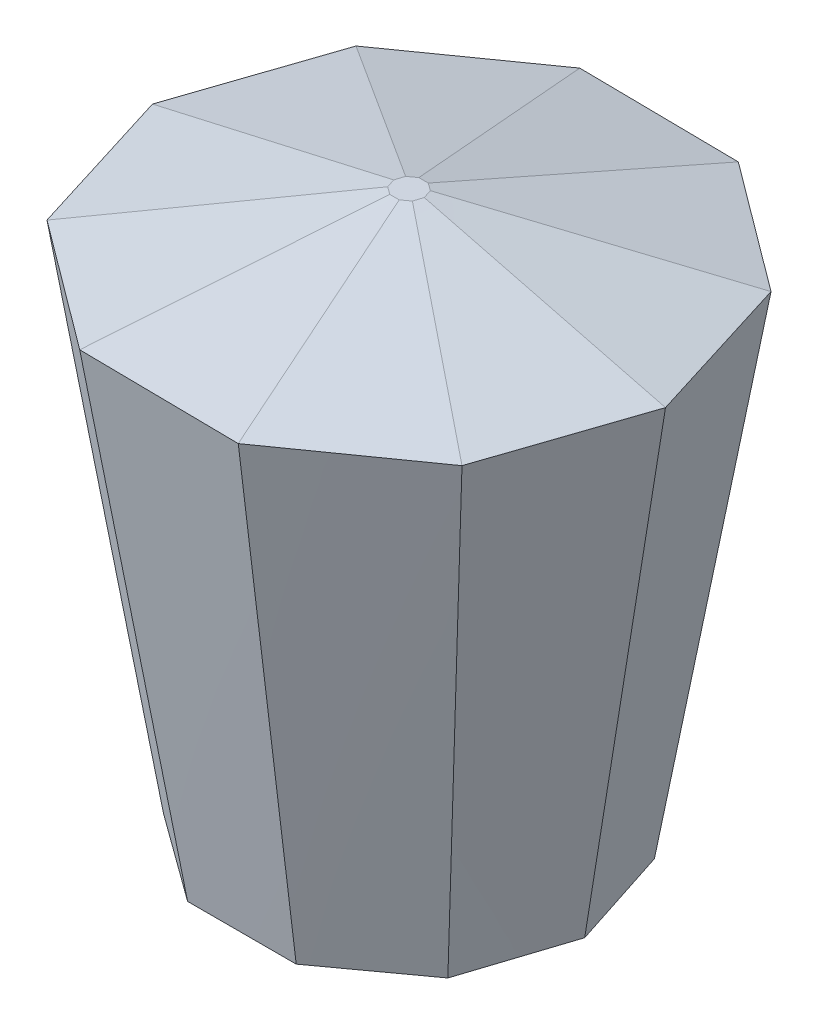
ISO-10303-21;
HEADER;
FILE_DESCRIPTION(('STEP AP214'),'2;1');
FILE_NAME('part.step','',(''),(''),'','','');
FILE_SCHEMA(('AUTOMOTIVE_DESIGN { 1 0 10303 214 1 1 1 1 }'));
ENDSEC;
DATA;
#1=APPLICATION_CONTEXT('core data for automotive mechanical design processes');
#2=APPLICATION_PROTOCOL_DEFINITION('international standard','automotive_design',2000,#1);
#3=PRODUCT_CONTEXT('',#1,'mechanical');
#4=PRODUCT('Part','Part','',(#3));
#5=PRODUCT_RELATED_PRODUCT_CATEGORY('part','',(#4));
#6=PRODUCT_DEFINITION_FORMATION('','',#4);
#7=PRODUCT_DEFINITION_CONTEXT('part definition',#1,'design');
#8=PRODUCT_DEFINITION('design','',#6,#7);
#9=PRODUCT_DEFINITION_SHAPE('','',#8);
#10=(LENGTH_UNIT() NAMED_UNIT(*) SI_UNIT(.MILLI.,.METRE.));
#11=(NAMED_UNIT(*) PLANE_ANGLE_UNIT() SI_UNIT($,.RADIAN.));
#12=(NAMED_UNIT(*) SI_UNIT($,.STERADIAN.) SOLID_ANGLE_UNIT());
#13=UNCERTAINTY_MEASURE_WITH_UNIT(LENGTH_MEASURE(1.E-05),#10,'distance_accuracy_value','');
#14=(GEOMETRIC_REPRESENTATION_CONTEXT(3) GLOBAL_UNCERTAINTY_ASSIGNED_CONTEXT((#13)) GLOBAL_UNIT_ASSIGNED_CONTEXT((#10,
#11,#12)) REPRESENTATION_CONTEXT('',''));
#15=CARTESIAN_POINT('',(0.,0.,0.));
#16=DIRECTION('',(0.,0.,1.));
#17=DIRECTION('',(1.,0.,0.));
#18=AXIS2_PLACEMENT_3D('',#15,#16,#17);
#19=CARTESIAN_POINT('',(0.,0.,0.));
#20=DIRECTION('',(0.,1.,0.));
#21=DIRECTION('',(0.,0.,1.));
#22=AXIS2_PLACEMENT_3D('',#19,#20,#21);
#23=PLANE('',#22);
#24=CARTESIAN_POINT('',(0.,0.,0.));
#25=DIRECTION('',(0.,-1.,0.));
#26=DIRECTION('',(0.,0.,-1.));
#27=AXIS2_PLACEMENT_3D('',#24,#25,#26);
#28=CIRCLE('',#27,1.5);
#29=CARTESIAN_POINT('',(0.,0.,-1.5));
#30=VERTEX_POINT('',#29);
#31=EDGE_CURVE('E1065',#30,#30,#28,.T.);
#32=ORIENTED_EDGE('',*,*,#31,.F.);
#33=EDGE_LOOP('',(#32));
#34=FACE_BOUND('',#33,.T.);
#35=DIRECTION('',(-0.309016994374941,0.,0.951056516295156));
#36=VECTOR('',#35,1.);
#37=CARTESIAN_POINT('',(-4.89124214802425,0.,-3.55369543531187));
#38=LINE('',#37,#36);
#39=CARTESIAN_POINT('',(-4.89124214802425,0.,-3.55369543531187));
#40=VERTEX_POINT('',#39);
#41=CARTESIAN_POINT('',(-6.04590778937004,0.,0.));
#42=VERTEX_POINT('',#41);
#43=EDGE_CURVE('E338',#40,#42,#38,.T.);
#44=ORIENTED_EDGE('',*,*,#43,.F.);
#45=DIRECTION('',(-0.809016994374944,0.,0.587785252292477));
#46=VECTOR('',#45,1.);
#47=CARTESIAN_POINT('',(-1.86828825333925,0.,-5.74999999999999));
#48=LINE('',#47,#46);
#49=CARTESIAN_POINT('',(-1.86828825333925,0.,-5.74999999999999));
#50=VERTEX_POINT('',#49);
#51=EDGE_CURVE('E621',#50,#40,#48,.T.);
#52=ORIENTED_EDGE('',*,*,#51,.F.);
#53=DIRECTION('',(-1.,0.,0.));
#54=VECTOR('',#53,1.);
#55=CARTESIAN_POINT('',(1.86828825333918,0.,-5.75000000000001));
#56=LINE('',#55,#54);
#57=CARTESIAN_POINT('',(1.86828825333918,0.,-5.75000000000001));
#58=VERTEX_POINT('',#57);
#59=EDGE_CURVE('E618',#58,#50,#56,.T.);
#60=ORIENTED_EDGE('',*,*,#59,.F.);
#61=DIRECTION('',(-0.80901699437495,0.,-0.587785252292469));
#62=VECTOR('',#61,1.);
#63=CARTESIAN_POINT('',(4.89124214802421,0.,-3.55369543531193));
#64=LINE('',#63,#62);
#65=CARTESIAN_POINT('',(4.89124214802421,0.,-3.55369543531193));
#66=VERTEX_POINT('',#65);
#67=EDGE_CURVE('E614',#66,#58,#64,.T.);
#68=ORIENTED_EDGE('',*,*,#67,.F.);
#69=DIRECTION('',(-0.309016994374952,0.,-0.951056516295152));
#70=VECTOR('',#69,1.);
#71=CARTESIAN_POINT('',(6.04590778937004,0.,0.));
#72=LINE('',#71,#70);
#73=CARTESIAN_POINT('',(6.04590778937004,0.,0.));
#74=VERTEX_POINT('',#73);
#75=EDGE_CURVE('E610',#74,#66,#72,.T.);
#76=ORIENTED_EDGE('',*,*,#75,.F.);
#77=DIRECTION('',(0.309016994374942,0.,-0.951056516295155));
#78=VECTOR('',#77,1.);
#79=CARTESIAN_POINT('',(4.89124214802425,0.,3.55369543531187));
#80=LINE('',#79,#78);
#81=CARTESIAN_POINT('',(4.89124214802425,0.,3.55369543531187));
#82=VERTEX_POINT('',#81);
#83=EDGE_CURVE('E606',#82,#74,#80,.T.);
#84=ORIENTED_EDGE('',*,*,#83,.F.);
#85=DIRECTION('',(0.809016994374944,0.,-0.587785252292478));
#86=VECTOR('',#85,1.);
#87=CARTESIAN_POINT('',(1.86828825333925,0.,5.74999999999999));
#88=LINE('',#87,#86);
#89=CARTESIAN_POINT('',(1.86828825333925,0.,5.74999999999999));
#90=VERTEX_POINT('',#89);
#91=EDGE_CURVE('E602',#90,#82,#88,.T.);
#92=ORIENTED_EDGE('',*,*,#91,.F.);
#93=DIRECTION('',(1.,0.,0.));
#94=VECTOR('',#93,1.);
#95=CARTESIAN_POINT('',(-1.86828825333917,0.,5.75000000000001));
#96=LINE('',#95,#94);
#97=CARTESIAN_POINT('',(-1.86828825333917,0.,5.75000000000001));
#98=VERTEX_POINT('',#97);
#99=EDGE_CURVE('E598',#98,#90,#96,.T.);
#100=ORIENTED_EDGE('',*,*,#99,.F.);
#101=DIRECTION('',(0.809016994374951,0.,0.587785252292468));
#102=VECTOR('',#101,1.);
#103=CARTESIAN_POINT('',(-4.89124214802421,0.,3.55369543531193));
#104=LINE('',#103,#102);
#105=CARTESIAN_POINT('',(-4.89124214802421,0.,3.55369543531193));
#106=VERTEX_POINT('',#105);
#107=EDGE_CURVE('E594',#106,#98,#104,.T.);
#108=ORIENTED_EDGE('',*,*,#107,.F.);
#109=DIRECTION('',(0.309016994374953,0.,0.951056516295152));
#110=VECTOR('',#109,1.);
#111=CARTESIAN_POINT('',(-6.04590778937004,0.,0.));
#112=LINE('',#111,#110);
#113=EDGE_CURVE('E341',#42,#106,#112,.T.);
#114=ORIENTED_EDGE('',*,*,#113,.F.);
#115=EDGE_LOOP('',(#44,#52,#60,#68,#76,#84,#92,#100,#108,#114));
#116=FACE_BOUND('',#115,.T.);
#117=ADVANCED_FACE('F81',(#34,#116),#23,.F.);
#118=CARTESIAN_POINT('',(1.86828825333925,0.,5.74999999999999));
#119=CARTESIAN_POINT('',(2.65710839258467,17.3,8.53331180962657));
#120=CARTESIAN_POINT('',(2.37211390245342,0.,5.38394923921863));
#121=CARTESIAN_POINT('',(3.40849044055539,17.3,8.00139069891955));
#122=CARTESIAN_POINT('',(2.87593955156759,0.,5.01789847843727));
#123=CARTESIAN_POINT('',(4.15987248852611,17.3,7.46946958821254));
#124=CARTESIAN_POINT('',(3.88359084979592,0.,4.28579695687457));
#125=CARTESIAN_POINT('',(5.66263658446755,17.3,6.40562736679852));
#126=CARTESIAN_POINT('',(4.38741649891009,0.,3.91974619609322));
#127=CARTESIAN_POINT('',(6.41401863243827,17.3,5.87370625609151));
#128=CARTESIAN_POINT('',(4.89124214802425,0.,3.55369543531187));
#129=CARTESIAN_POINT('',(7.16540068040899,17.3,5.3417851453845));
#130=B_SPLINE_SURFACE_WITH_KNOTS('',3,1,((#118,#119),(#120,#121),(#122,#123),(#124,#125),(#126,
#127),(#128,#129)),.UNSPECIFIED.,.F.,.F.,.F.,(4,2,4),(2,2),(0.,0.5,1.),(0.,1.),.UNSPECIFIED.);
#131=DIRECTION('',(0.129653988252277,0.986305028793359,0.101942304796433));
#132=VECTOR('',#131,1.);
#133=CARTESIAN_POINT('',(6.02832141421662,8.65,4.44774029034818));
#134=LINE('',#133,#132);
#135=CARTESIAN_POINT('',(7.16540068040899,17.3,5.3417851453845));
#136=VERTEX_POINT('',#135);
#137=EDGE_CURVE('E805',#82,#136,#134,.T.);
#138=DIRECTION('',(0.81618217382418,0.,-0.577794651352568));
#139=VECTOR('',#138,1.);
#140=CARTESIAN_POINT('',(2.65710839258467,17.3,8.53331180962657));
#141=LINE('',#140,#139);
#142=CARTESIAN_POINT('',(2.65710839258467,17.3,8.53331180962657));
#143=VERTEX_POINT('',#142);
#144=EDGE_CURVE('E835',#143,#136,#141,.T.);
#145=DIRECTION('',(-0.0449720965405342,-0.986305028793359,-0.158681759221655));
#146=VECTOR('',#145,1.);
#147=CARTESIAN_POINT('',(2.26269832296196,8.65,7.14165590481328));
#148=LINE('',#147,#146);
#149=EDGE_CURVE('E626',#143,#90,#148,.T.);
#150=ORIENTED_EDGE('',*,*,#91,.T.);
#151=ORIENTED_EDGE('',*,*,#137,.T.);
#152=ORIENTED_EDGE('',*,*,#144,.F.);
#153=ORIENTED_EDGE('',*,*,#149,.T.);
#154=EDGE_LOOP('',(#150,#151,#152,#153));
#155=FACE_BOUND('',#154,.T.);
#156=ADVANCED_FACE('F525',(#155),#130,.T.);
#157=CARTESIAN_POINT('',(4.89124214802425,0.,3.55369543531187));
#158=CARTESIAN_POINT('',(7.16540068040899,17.3,5.3417851453845));
#159=CARTESIAN_POINT('',(5.08368642158188,0.,2.96141286275989));
#160=CARTESIAN_POINT('',(7.46062614222894,17.3,4.46980064052122));
#161=CARTESIAN_POINT('',(5.27613069513951,0.,2.3691302902079));
#162=CARTESIAN_POINT('',(7.75585160404889,17.3,3.59781613565795));
#163=CARTESIAN_POINT('',(5.66101924225477,0.,1.18456514510394));
#164=CARTESIAN_POINT('',(8.3463025276888,17.3,1.8538471259314));
#165=CARTESIAN_POINT('',(5.8534635158124,0.,0.592282572551953));
#166=CARTESIAN_POINT('',(8.64152798950875,17.3,0.981862621068127));
#167=CARTESIAN_POINT('',(6.04590778937004,0.,0.));
#168=CARTESIAN_POINT('',(8.9367534513287,17.3,0.109878116204851));
#169=B_SPLINE_SURFACE_WITH_KNOTS('',3,1,((#157,#158),(#159,#160),(#161,#162),(#163,#164),(#165,
#166),(#167,#168)),.UNSPECIFIED.,.F.,.F.,.F.,(4,2,4),(2,2),(0.,0.5,1.),(0.,1.),.UNSPECIFIED.);
#170=DIRECTION('',(0.16481246322863,0.986305028793359,0.00626435483047493));
#171=VECTOR('',#170,1.);
#172=CARTESIAN_POINT('',(7.49133062034937,8.65,0.0549390581024102));
#173=LINE('',#172,#171);
#174=CARTESIAN_POINT('',(8.9367534513287,17.3,0.109878116204851));
#175=VERTEX_POINT('',#174);
#176=EDGE_CURVE('E784',#74,#175,#173,.T.);
#177=DIRECTION('',(0.320686074211139,0.,-0.94718553716104));
#178=VECTOR('',#177,1.);
#179=CARTESIAN_POINT('',(7.16540068040899,17.3,5.3417851453845));
#180=LINE('',#179,#178);
#181=EDGE_CURVE('E834',#136,#175,#180,.T.);
#182=ORIENTED_EDGE('',*,*,#83,.T.);
#183=ORIENTED_EDGE('',*,*,#176,.T.);
#184=ORIENTED_EDGE('',*,*,#181,.F.);
#185=ORIENTED_EDGE('',*,*,#137,.F.);
#186=EDGE_LOOP('',(#182,#183,#184,#185));
#187=FACE_BOUND('',#186,.T.);
#188=ADVANCED_FACE('F747',(#187),#169,.T.);
#189=CARTESIAN_POINT('',(-1.86828825333917,0.,5.75000000000001));
#190=CARTESIAN_POINT('',(-2.86610898941439,17.3,8.46540339919216));
#191=CARTESIAN_POINT('',(-1.2455255022261,0.,5.75000000000001));
#192=CARTESIAN_POINT('',(-1.94557275908122,17.3,8.47672146759789));
#193=CARTESIAN_POINT('',(-0.622762751113034,0.,5.75000000000001));
#194=CARTESIAN_POINT('',(-1.02503652874804,17.3,8.48803953600362));
#195=CARTESIAN_POINT('',(0.622762751113107,0.,5.75));
#196=CARTESIAN_POINT('',(0.816035931918318,17.3,8.51067567281509));
#197=CARTESIAN_POINT('',(1.24552550222618,0.,5.74999999999999));
#198=CARTESIAN_POINT('',(1.7365721622515,17.3,8.52199374122083));
#199=CARTESIAN_POINT('',(1.86828825333925,0.,5.74999999999999));
#200=CARTESIAN_POINT('',(2.65710839258468,17.3,8.53331180962657));
#201=B_SPLINE_SURFACE_WITH_KNOTS('',3,1,((#189,#190),(#191,#192),(#193,#194),(#195,#196),(#197,
#198),(#199,#200)),.UNSPECIFIED.,.F.,.F.,.F.,(4,2,4),(2,2),(0.,0.5,1.),(0.,1.),.UNSPECIFIED.);
#202=DIRECTION('',(0.99992442404816,0.,0.0122941527546897));
#203=VECTOR('',#202,1.);
#204=CARTESIAN_POINT('',(-2.86610898941439,17.3,8.46540339919216));
#205=LINE('',#204,#203);
#206=CARTESIAN_POINT('',(-2.86610898941439,17.3,8.46540339919216));
#207=VERTEX_POINT('',#206);
#208=EDGE_CURVE('E109',#207,#143,#205,.T.);
#209=DIRECTION('',(-0.0568876075043514,0.986305028793359,0.154810175018832));
#210=VECTOR('',#209,1.);
#211=CARTESIAN_POINT('',(-2.36719862137678,8.65,7.10770169959608));
#212=LINE('',#211,#210);
#213=EDGE_CURVE('E710',#98,#207,#212,.T.);
#214=ORIENTED_EDGE('',*,*,#99,.T.);
#215=ORIENTED_EDGE('',*,*,#149,.F.);
#216=ORIENTED_EDGE('',*,*,#208,.F.);
#217=ORIENTED_EDGE('',*,*,#213,.F.);
#218=EDGE_LOOP('',(#214,#215,#216,#217));
#219=FACE_BOUND('',#218,.T.);
#220=ADVANCED_FACE('F735',(#219),#201,.T.);
#221=CARTESIAN_POINT('',(6.04590778937004,0.,0.));
#222=CARTESIAN_POINT('',(8.9367534513287,17.3,0.109878116204851));
#223=CARTESIAN_POINT('',(5.8534635158124,0.,-0.592282572552014));
#224=CARTESIAN_POINT('',(8.66305623492705,17.3,-0.769101339620164));
#225=CARTESIAN_POINT('',(5.66101924225476,0.,-1.184565145104));
#226=CARTESIAN_POINT('',(8.38935901852539,17.3,-1.64808079544518));
#227=CARTESIAN_POINT('',(5.27613069513948,0.,-2.36913029020796));
#228=CARTESIAN_POINT('',(7.84196458572208,17.3,-3.40603970709521));
#229=CARTESIAN_POINT('',(5.08368642158185,0.,-2.96141286275994));
#230=CARTESIAN_POINT('',(7.56826736932043,17.3,-4.28501916292022));
#231=CARTESIAN_POINT('',(4.89124214802421,0.,-3.55369543531193));
#232=CARTESIAN_POINT('',(7.29457015291877,17.3,-5.16399861874523));
#233=B_SPLINE_SURFACE_WITH_KNOTS('',3,1,((#221,#222),(#223,#224),(#225,#226),(#227,#228),(#229,
#230),(#231,#232)),.UNSPECIFIED.,.F.,.F.,.F.,(4,2,4),(2,2),(0.,0.5,1.),(0.,1.),.UNSPECIFIED.);
#234=DIRECTION('',(0.137018179021238,0.986305028793359,-0.0918063657631344));
#235=VECTOR('',#234,1.);
#236=CARTESIAN_POINT('',(6.09290615047149,8.65,-4.35884702702858));
#237=LINE('',#236,#235);
#238=CARTESIAN_POINT('',(7.29457015291877,17.3,-5.16399861874523));
#239=VERTEX_POINT('',#238);
#240=EDGE_CURVE('E648',#66,#239,#237,.T.);
#241=DIRECTION('',(-0.297301206031788,0.,-0.954783741426321));
#242=VECTOR('',#241,1.);
#243=CARTESIAN_POINT('',(8.9367534513287,17.3,0.109878116204851));
#244=LINE('',#243,#242);
#245=EDGE_CURVE('E802',#175,#239,#244,.T.);
#246=ORIENTED_EDGE('',*,*,#75,.T.);
#247=ORIENTED_EDGE('',*,*,#240,.T.);
#248=ORIENTED_EDGE('',*,*,#245,.F.);
#249=ORIENTED_EDGE('',*,*,#176,.F.);
#250=EDGE_LOOP('',(#246,#247,#248,#249));
#251=FACE_BOUND('',#250,.T.);
#252=ADVANCED_FACE('F746',(#251),#233,.T.);
#253=CARTESIAN_POINT('',(4.89124214802421,0.,-3.55369543531193));
#254=CARTESIAN_POINT('',(7.29457015291877,17.3,-5.16399861874523));
#255=CARTESIAN_POINT('',(4.38741649891003,0.,-3.91974619609328));
#256=CARTESIAN_POINT('',(6.5564932923347,17.3,-5.71423274881972));
#257=CARTESIAN_POINT('',(3.88359084979586,0.,-4.28579695687463));
#258=CARTESIAN_POINT('',(5.81841643175064,17.3,-6.26446687889421));
#259=CARTESIAN_POINT('',(2.87593955156751,0.,-5.01789847843732));
#260=CARTESIAN_POINT('',(4.34226271058251,17.3,-7.36493513904318));
#261=CARTESIAN_POINT('',(2.37211390245335,0.,-5.38394923921867));
#262=CARTESIAN_POINT('',(3.60418584999845,17.3,-7.91516926911767));
#263=CARTESIAN_POINT('',(1.86828825333918,0.,-5.75000000000001));
#264=CARTESIAN_POINT('',(2.86610898941439,17.3,-8.46540339919215));
#265=B_SPLINE_SURFACE_WITH_KNOTS('',3,1,((#253,#254),(#255,#256),(#257,#258),(#259,#260),(#261,
#262),(#263,#264)),.UNSPECIFIED.,.F.,.F.,.F.,(4,2,4),(2,2),(0.,0.5,1.),(0.,1.),.UNSPECIFIED.);
#266=DIRECTION('',(0.0568876075043512,0.986305028793359,-0.154810175018832));
#267=VECTOR('',#266,1.);
#268=CARTESIAN_POINT('',(2.36719862137679,8.65,-7.10770169959608));
#269=LINE('',#268,#267);
#270=CARTESIAN_POINT('',(2.86610898941439,17.3,-8.46540339919215));
#271=VERTEX_POINT('',#270);
#272=EDGE_CURVE('E641',#58,#271,#269,.T.);
#273=DIRECTION('',(-0.801729530466905,0.,-0.597687008372539));
#274=VECTOR('',#273,1.);
#275=CARTESIAN_POINT('',(7.29457015291877,17.3,-5.16399861874523));
#276=LINE('',#275,#274);
#277=EDGE_CURVE('E837',#239,#271,#276,.T.);
#278=ORIENTED_EDGE('',*,*,#67,.T.);
#279=ORIENTED_EDGE('',*,*,#272,.T.);
#280=ORIENTED_EDGE('',*,*,#277,.F.);
#281=ORIENTED_EDGE('',*,*,#240,.F.);
#282=EDGE_LOOP('',(#278,#279,#280,#281));
#283=FACE_BOUND('',#282,.T.);
#284=ADVANCED_FACE('F761',(#283),#265,.T.);
#285=CARTESIAN_POINT('',(1.86828825333918,0.,-5.75000000000001));
#286=CARTESIAN_POINT('',(2.8661089894144,17.3,-8.46540339919215));
#287=CARTESIAN_POINT('',(1.24552550222611,0.,-5.75000000000001));
#288=CARTESIAN_POINT('',(1.94557275908122,17.3,-8.47672146759789));
#289=CARTESIAN_POINT('',(0.622762751113038,0.,-5.75000000000001));
#290=CARTESIAN_POINT('',(1.02503652874804,17.3,-8.48803953600362));
#291=CARTESIAN_POINT('',(-0.622762751113104,0.,-5.75));
#292=CARTESIAN_POINT('',(-0.816035931918313,17.3,-8.51067567281509));
#293=CARTESIAN_POINT('',(-1.24552550222618,0.,-5.74999999999999));
#294=CARTESIAN_POINT('',(-1.73657216225149,17.3,-8.52199374122083));
#295=CARTESIAN_POINT('',(-1.86828825333925,0.,-5.74999999999999));
#296=CARTESIAN_POINT('',(-2.65710839258467,17.3,-8.53331180962656));
#297=B_SPLINE_SURFACE_WITH_KNOTS('',3,1,((#285,#286),(#287,#288),(#289,#290),(#291,#292),(#293,
#294),(#295,#296)),.UNSPECIFIED.,.F.,.F.,.F.,(4,2,4),(2,2),(0.,0.5,1.),(0.,1.),.UNSPECIFIED.);
#298=DIRECTION('',(-0.044972096540534,0.986305028793359,-0.158681759221655));
#299=VECTOR('',#298,1.);
#300=CARTESIAN_POINT('',(-2.26269832296196,8.65,-7.14165590481328));
#301=LINE('',#300,#299);
#302=CARTESIAN_POINT('',(-2.65710839258467,17.3,-8.53331180962656));
#303=VERTEX_POINT('',#302);
#304=EDGE_CURVE('E101',#50,#303,#301,.T.);
#305=DIRECTION('',(-0.99992442404816,0.,-0.0122941527546894));
#306=VECTOR('',#305,1.);
#307=CARTESIAN_POINT('',(2.8661089894144,17.3,-8.46540339919215));
#308=LINE('',#307,#306);
#309=EDGE_CURVE('E93',#271,#303,#308,.T.);
#310=ORIENTED_EDGE('',*,*,#59,.T.);
#311=ORIENTED_EDGE('',*,*,#304,.T.);
#312=ORIENTED_EDGE('',*,*,#309,.F.);
#313=ORIENTED_EDGE('',*,*,#272,.F.);
#314=EDGE_LOOP('',(#310,#311,#312,#313));
#315=FACE_BOUND('',#314,.T.);
#316=ADVANCED_FACE('F639',(#315),#297,.T.);
#317=CARTESIAN_POINT('',(-1.86828825333925,0.,-5.74999999999999));
#318=CARTESIAN_POINT('',(-2.65710839258467,17.3,-8.53331180962656));
#319=CARTESIAN_POINT('',(-2.37211390245342,0.,-5.38394923921864));
#320=CARTESIAN_POINT('',(-3.40849044055539,17.3,-8.00139069891955));
#321=CARTESIAN_POINT('',(-2.87593955156758,0.,-5.01789847843728));
#322=CARTESIAN_POINT('',(-4.15987248852611,17.3,-7.46946958821254));
#323=CARTESIAN_POINT('',(-3.88359084979592,0.,-4.28579695687457));
#324=CARTESIAN_POINT('',(-5.66263658446755,17.3,-6.40562736679852));
#325=CARTESIAN_POINT('',(-4.38741649891009,0.,-3.91974619609322));
#326=CARTESIAN_POINT('',(-6.41401863243827,17.3,-5.87370625609151));
#327=CARTESIAN_POINT('',(-4.89124214802425,0.,-3.55369543531187));
#328=CARTESIAN_POINT('',(-7.16540068040899,17.3,-5.3417851453845));
#329=B_SPLINE_SURFACE_WITH_KNOTS('',3,1,((#317,#318),(#319,#320),(#321,#322),(#323,#324),(#325,
#326),(#327,#328)),.UNSPECIFIED.,.F.,.F.,.F.,(4,2,4),(2,2),(0.,0.5,1.),(0.,1.),.UNSPECIFIED.);
#330=DIRECTION('',(-0.129653988252277,0.986305028793359,-0.101942304796433));
#331=VECTOR('',#330,1.);
#332=CARTESIAN_POINT('',(-6.02832141421662,8.65,-4.44774029034819));
#333=LINE('',#332,#331);
#334=CARTESIAN_POINT('',(-7.16540068040899,17.3,-5.3417851453845));
#335=VERTEX_POINT('',#334);
#336=EDGE_CURVE('E644',#40,#335,#333,.T.);
#337=DIRECTION('',(-0.816182173824181,0.,0.577794651352567));
#338=VECTOR('',#337,1.);
#339=CARTESIAN_POINT('',(-2.65710839258467,17.3,-8.53331180962656));
#340=LINE('',#339,#338);
#341=EDGE_CURVE('E12',#303,#335,#340,.T.);
#342=ORIENTED_EDGE('',*,*,#51,.T.);
#343=ORIENTED_EDGE('',*,*,#336,.T.);
#344=ORIENTED_EDGE('',*,*,#341,.F.);
#345=ORIENTED_EDGE('',*,*,#304,.F.);
#346=EDGE_LOOP('',(#342,#343,#344,#345));
#347=FACE_BOUND('',#346,.T.);
#348=ADVANCED_FACE('F643',(#347),#329,.T.);
#349=CARTESIAN_POINT('',(-4.89124214802425,0.,-3.55369543531187));
#350=CARTESIAN_POINT('',(-7.16540068040899,17.3,-5.3417851453845));
#351=CARTESIAN_POINT('',(-5.08368642158188,0.,-2.96141286275988));
#352=CARTESIAN_POINT('',(-7.46062614222894,17.3,-4.46980064052123));
#353=CARTESIAN_POINT('',(-5.27613069513952,0.,-2.3691302902079));
#354=CARTESIAN_POINT('',(-7.75585160404889,17.3,-3.59781613565795));
#355=CARTESIAN_POINT('',(-5.66101924225477,0.,-1.18456514510393));
#356=CARTESIAN_POINT('',(-8.34630252768879,17.3,-1.85384712593141));
#357=CARTESIAN_POINT('',(-5.85346351581241,0.,-0.592282572551948));
#358=CARTESIAN_POINT('',(-8.64152798950874,17.3,-0.981862621068134));
#359=CARTESIAN_POINT('',(-6.04590778937004,0.,0.));
#360=CARTESIAN_POINT('',(-8.93675345132869,17.3,-0.10987811620486));
#361=B_SPLINE_SURFACE_WITH_KNOTS('',3,1,((#349,#350),(#351,#352),(#353,#354),(#355,#356),(#357,
#358),(#359,#360)),.UNSPECIFIED.,.F.,.F.,.F.,(4,2,4),(2,2),(0.,0.5,1.),(0.,1.),.UNSPECIFIED.);
#362=DIRECTION('',(-0.16481246322863,0.986305028793359,-0.00626435483047569));
#363=VECTOR('',#362,1.);
#364=CARTESIAN_POINT('',(-7.49133062034937,8.65,-0.0549390581024121));
#365=LINE('',#364,#363);
#366=CARTESIAN_POINT('',(-8.93675345132869,17.3,-0.10987811620486));
#367=VERTEX_POINT('',#366);
#368=EDGE_CURVE('E646',#42,#367,#365,.T.);
#369=DIRECTION('',(-0.320686074211139,0.,0.94718553716104));
#370=VECTOR('',#369,1.);
#371=CARTESIAN_POINT('',(-7.16540068040899,17.3,-5.3417851453845));
#372=LINE('',#371,#370);
#373=EDGE_CURVE('E725',#335,#367,#372,.T.);
#374=ORIENTED_EDGE('',*,*,#43,.T.);
#375=ORIENTED_EDGE('',*,*,#368,.T.);
#376=ORIENTED_EDGE('',*,*,#373,.F.);
#377=ORIENTED_EDGE('',*,*,#336,.F.);
#378=EDGE_LOOP('',(#374,#375,#376,#377));
#379=FACE_BOUND('',#378,.T.);
#380=ADVANCED_FACE('F668',(#379),#361,.T.);
#381=CARTESIAN_POINT('',(-6.04590778937004,0.,0.));
#382=CARTESIAN_POINT('',(-8.93675345132869,17.3,-0.10987811620486));
#383=CARTESIAN_POINT('',(-5.8534635158124,0.,0.592282572552018));
#384=CARTESIAN_POINT('',(-8.66305623492704,17.3,0.769101339620151));
#385=CARTESIAN_POINT('',(-5.66101924225476,0.,1.184565145104));
#386=CARTESIAN_POINT('',(-8.38935901852539,17.3,1.64808079544516));
#387=CARTESIAN_POINT('',(-5.27613069513948,0.,2.36913029020796));
#388=CARTESIAN_POINT('',(-7.84196458572208,17.3,3.40603970709519));
#389=CARTESIAN_POINT('',(-5.08368642158185,0.,2.96141286275994));
#390=CARTESIAN_POINT('',(-7.56826736932043,17.3,4.28501916292021));
#391=CARTESIAN_POINT('',(-4.89124214802421,0.,3.55369543531193));
#392=CARTESIAN_POINT('',(-7.29457015291877,17.3,5.16399861874523));
#393=B_SPLINE_SURFACE_WITH_KNOTS('',3,1,((#381,#382),(#383,#384),(#385,#386),(#387,#388),(#389,
#390),(#391,#392)),.UNSPECIFIED.,.F.,.F.,.F.,(4,2,4),(2,2),(0.,0.5,1.),(0.,1.),.UNSPECIFIED.);
#394=DIRECTION('',(-0.137018179021238,0.986305028793359,0.0918063657631345));
#395=VECTOR('',#394,1.);
#396=CARTESIAN_POINT('',(-6.09290615047149,8.65,4.35884702702858));
#397=LINE('',#396,#395);
#398=CARTESIAN_POINT('',(-7.29457015291877,17.3,5.16399861874523));
#399=VERTEX_POINT('',#398);
#400=EDGE_CURVE('E702',#106,#399,#397,.T.);
#401=DIRECTION('',(0.297301206031787,0.,0.954783741426322));
#402=VECTOR('',#401,1.);
#403=CARTESIAN_POINT('',(-8.93675345132869,17.3,-0.10987811620486));
#404=LINE('',#403,#402);
#405=EDGE_CURVE('E337',#367,#399,#404,.T.);
#406=ORIENTED_EDGE('',*,*,#113,.T.);
#407=ORIENTED_EDGE('',*,*,#400,.T.);
#408=ORIENTED_EDGE('',*,*,#405,.F.);
#409=ORIENTED_EDGE('',*,*,#368,.F.);
#410=EDGE_LOOP('',(#406,#407,#408,#409));
#411=FACE_BOUND('',#410,.T.);
#412=ADVANCED_FACE('F678',(#411),#393,.T.);
#413=CARTESIAN_POINT('',(-4.89124214802421,0.,3.55369543531193));
#414=CARTESIAN_POINT('',(-7.29457015291877,17.3,5.16399861874523));
#415=CARTESIAN_POINT('',(-4.38741649891004,0.,3.91974619609327));
#416=CARTESIAN_POINT('',(-6.55649329233471,17.3,5.71423274881972));
#417=CARTESIAN_POINT('',(-3.88359084979587,0.,4.28579695687462));
#418=CARTESIAN_POINT('',(-5.81841643175064,17.3,6.26446687889421));
#419=CARTESIAN_POINT('',(-2.87593955156752,0.,5.01789847843731));
#420=CARTESIAN_POINT('',(-4.34226271058252,17.3,7.36493513904318));
#421=CARTESIAN_POINT('',(-2.37211390245335,0.,5.38394923921866));
#422=CARTESIAN_POINT('',(-3.60418584999846,17.3,7.91516926911767));
#423=CARTESIAN_POINT('',(-1.86828825333917,0.,5.75000000000001));
#424=CARTESIAN_POINT('',(-2.86610898941439,17.3,8.46540339919216));
#425=B_SPLINE_SURFACE_WITH_KNOTS('',3,1,((#413,#414),(#415,#416),(#417,#418),(#419,#420),(#421,
#422),(#423,#424)),.UNSPECIFIED.,.F.,.F.,.F.,(4,2,4),(2,2),(0.,0.5,1.),(0.,1.),.UNSPECIFIED.);
#426=DIRECTION('',(0.801729530466905,0.,0.597687008372539));
#427=VECTOR('',#426,1.);
#428=CARTESIAN_POINT('',(-7.29457015291877,17.3,5.16399861874523));
#429=LINE('',#428,#427);
#430=EDGE_CURVE('E848',#399,#207,#429,.T.);
#431=ORIENTED_EDGE('',*,*,#107,.T.);
#432=ORIENTED_EDGE('',*,*,#213,.T.);
#433=ORIENTED_EDGE('',*,*,#430,.F.);
#434=ORIENTED_EDGE('',*,*,#400,.F.);
#435=EDGE_LOOP('',(#431,#432,#433,#434));
#436=FACE_BOUND('',#435,.T.);
#437=ADVANCED_FACE('F83',(#436),#425,.T.);
#438=CARTESIAN_POINT('',(0.,19.3,0.));
#439=DIRECTION('',(0.,1.,0.));
#440=DIRECTION('',(0.,0.,1.));
#441=AXIS2_PLACEMENT_3D('',#438,#439,#440);
#442=PLANE('',#441);
#443=DIRECTION('',(-0.309016994374941,0.,0.951056516295156));
#444=VECTOR('',#443,1.);
#445=CARTESIAN_POINT('',(-0.425325404176022,19.3,-0.309016994374945));
#446=LINE('',#445,#444);
#447=CARTESIAN_POINT('',(-0.425325404176022,19.3,-0.309016994374945));
#448=VERTEX_POINT('',#447);
#449=CARTESIAN_POINT('',(-0.525731112119134,19.3,0.));
#450=VERTEX_POINT('',#449);
#451=EDGE_CURVE('E310',#448,#450,#446,.T.);
#452=ORIENTED_EDGE('',*,*,#451,.T.);
#453=DIRECTION('',(0.309016994374954,0.,0.951056516295151));
#454=VECTOR('',#453,1.);
#455=CARTESIAN_POINT('',(-0.525731112119134,19.3,0.));
#456=LINE('',#455,#454);
#457=CARTESIAN_POINT('',(-0.425325404176018,19.3,0.30901699437495));
#458=VERTEX_POINT('',#457);
#459=EDGE_CURVE('E302',#450,#458,#456,.T.);
#460=ORIENTED_EDGE('',*,*,#459,.T.);
#461=DIRECTION('',(0.809016994374952,0.,0.587785252292468));
#462=VECTOR('',#461,1.);
#463=CARTESIAN_POINT('',(-0.425325404176018,19.3,0.30901699437495));
#464=LINE('',#463,#462);
#465=CARTESIAN_POINT('',(-0.16245984811645,19.3,0.500000000000001));
#466=VERTEX_POINT('',#465);
#467=EDGE_CURVE('E309',#458,#466,#464,.T.);
#468=ORIENTED_EDGE('',*,*,#467,.T.);
#469=DIRECTION('',(1.,0.,0.));
#470=VECTOR('',#469,1.);
#471=CARTESIAN_POINT('',(-0.16245984811645,19.3,0.500000000000001));
#472=LINE('',#471,#470);
#473=CARTESIAN_POINT('',(0.162459848116456,19.3,0.499999999999999));
#474=VERTEX_POINT('',#473);
#475=EDGE_CURVE('E314',#466,#474,#472,.T.);
#476=ORIENTED_EDGE('',*,*,#475,.T.);
#477=DIRECTION('',(0.809016994374944,0.,-0.587785252292478));
#478=VECTOR('',#477,1.);
#479=CARTESIAN_POINT('',(0.162459848116456,19.3,0.499999999999999));
#480=LINE('',#479,#478);
#481=CARTESIAN_POINT('',(0.425325404176022,19.3,0.309016994374945));
#482=VERTEX_POINT('',#481);
#483=EDGE_CURVE('E480',#474,#482,#480,.T.);
#484=ORIENTED_EDGE('',*,*,#483,.T.);
#485=DIRECTION('',(0.309016994374941,0.,-0.951056516295156));
#486=VECTOR('',#485,1.);
#487=CARTESIAN_POINT('',(0.425325404176022,19.3,0.309016994374945));
#488=LINE('',#487,#486);
#489=CARTESIAN_POINT('',(0.525731112119133,19.3,0.));
#490=VERTEX_POINT('',#489);
#491=EDGE_CURVE('E871',#482,#490,#488,.T.);
#492=ORIENTED_EDGE('',*,*,#491,.T.);
#493=DIRECTION('',(-0.309016994374954,0.,-0.951056516295152));
#494=VECTOR('',#493,1.);
#495=CARTESIAN_POINT('',(0.525731112119133,19.3,0.));
#496=LINE('',#495,#494);
#497=CARTESIAN_POINT('',(0.425325404176017,19.3,-0.309016994374951));
#498=VERTEX_POINT('',#497);
#499=EDGE_CURVE('E422',#490,#498,#496,.T.);
#500=ORIENTED_EDGE('',*,*,#499,.T.);
#501=DIRECTION('',(-0.809016994374952,0.,-0.587785252292467));
#502=VECTOR('',#501,1.);
#503=CARTESIAN_POINT('',(0.425325404176017,19.3,-0.309016994374951));
#504=LINE('',#503,#502);
#505=CARTESIAN_POINT('',(0.16245984811645,19.3,-0.500000000000001));
#506=VERTEX_POINT('',#505);
#507=EDGE_CURVE('E225',#498,#506,#504,.T.);
#508=ORIENTED_EDGE('',*,*,#507,.T.);
#509=DIRECTION('',(-1.,0.,0.));
#510=VECTOR('',#509,1.);
#511=CARTESIAN_POINT('',(0.16245984811645,19.3,-0.500000000000001));
#512=LINE('',#511,#510);
#513=CARTESIAN_POINT('',(-0.162459848116456,19.3,-0.499999999999999));
#514=VERTEX_POINT('',#513);
#515=EDGE_CURVE('E201',#506,#514,#512,.T.);
#516=ORIENTED_EDGE('',*,*,#515,.T.);
#517=DIRECTION('',(-0.809016994374944,0.,0.587785252292478));
#518=VECTOR('',#517,1.);
#519=CARTESIAN_POINT('',(-0.162459848116456,19.3,-0.499999999999999));
#520=LINE('',#519,#518);
#521=EDGE_CURVE('E209',#514,#448,#520,.T.);
#522=ORIENTED_EDGE('',*,*,#521,.T.);
#523=EDGE_LOOP('',(#452,#460,#468,#476,#484,#492,#500,#508,#516,#522));
#524=FACE_BOUND('',#523,.T.);
#525=ADVANCED_FACE('F223',(#524),#442,.T.);
#526=CARTESIAN_POINT('',(-0.525731112119134,19.3,0.));
#527=CARTESIAN_POINT('',(-8.93675345132869,17.3,-0.10987811620486));
#528=CARTESIAN_POINT('',(-0.508996827461948,19.3,-0.0515028323958214));
#529=CARTESIAN_POINT('',(-8.64152798950874,17.3,-0.981862621068133));
#530=CARTESIAN_POINT('',(-0.492262542804763,19.3,-0.103005664791646));
#531=CARTESIAN_POINT('',(-8.34630252768879,17.3,-1.85384712593141));
#532=CARTESIAN_POINT('',(-0.458793973490393,19.3,-0.206011329583295));
#533=CARTESIAN_POINT('',(-7.75585160404889,17.3,-3.59781613565795));
#534=CARTESIAN_POINT('',(-0.442059688833207,19.3,-0.25751416197912));
#535=CARTESIAN_POINT('',(-7.46062614222894,17.3,-4.46980064052123));
#536=CARTESIAN_POINT('',(-0.425325404176022,19.3,-0.309016994374945));
#537=CARTESIAN_POINT('',(-7.16540068040899,17.3,-5.3417851453845));
#538=B_SPLINE_SURFACE_WITH_KNOTS('',3,1,((#526,#527),(#528,#529),(#530,#531),(#532,#533),(#534,
#535),(#536,#537)),.UNSPECIFIED.,.F.,.F.,.F.,(4,2,4),(2,2),(0.,0.5,1.),(0.,1.),.UNSPECIFIED.);
#539=DIRECTION('',(-0.77953880651983,-0.231314569814572,-0.582076299913627));
#540=VECTOR('',#539,1.);
#541=CARTESIAN_POINT('',(-3.7953630422925,18.3,-2.82540106987972));
#542=LINE('',#541,#540);
#543=EDGE_CURVE('E206',#448,#335,#542,.T.);
#544=DIRECTION('',(0.972796007047507,0.231314569814572,0.0127082045909817));
#545=VECTOR('',#544,1.);
#546=CARTESIAN_POINT('',(-4.73124228172391,18.3,-0.0549390581024283));
#547=LINE('',#546,#545);
#548=EDGE_CURVE('E217',#367,#450,#547,.T.);
#549=ORIENTED_EDGE('',*,*,#451,.F.);
#550=ORIENTED_EDGE('',*,*,#543,.T.);
#551=ORIENTED_EDGE('',*,*,#373,.T.);
#552=ORIENTED_EDGE('',*,*,#548,.T.);
#553=EDGE_LOOP('',(#549,#550,#551,#552));
#554=FACE_BOUND('',#553,.T.);
#555=ADVANCED_FACE('F245',(#554),#538,.T.);
#556=CARTESIAN_POINT('',(-0.425325404176022,19.3,-0.309016994374945));
#557=CARTESIAN_POINT('',(-7.16540068040899,17.3,-5.3417851453845));
#558=CARTESIAN_POINT('',(-0.381514478166094,19.3,-0.340847495312454));
#559=CARTESIAN_POINT('',(-6.41401863243827,17.3,-5.87370625609151));
#560=CARTESIAN_POINT('',(-0.337703552156167,19.3,-0.372677996249963));
#561=CARTESIAN_POINT('',(-5.66263658446755,17.3,-6.40562736679852));
#562=CARTESIAN_POINT('',(-0.250081700136311,19.3,-0.436338998124981));
#563=CARTESIAN_POINT('',(-4.15987248852611,17.3,-7.46946958821254));
#564=CARTESIAN_POINT('',(-0.206270774126384,19.3,-0.46816949906249));
#565=CARTESIAN_POINT('',(-3.40849044055539,17.3,-8.00139069891955));
#566=CARTESIAN_POINT('',(-0.162459848116456,19.3,-0.499999999999999));
#567=CARTESIAN_POINT('',(-2.65710839258467,17.3,-8.53331180962656));
#568=B_SPLINE_SURFACE_WITH_KNOTS('',3,1,((#556,#557),(#558,#559),(#560,#561),(#562,#563),(#564,
#565),(#566,#567)),.UNSPECIFIED.,.F.,.F.,.F.,(4,2,4),(2,2),(0.,0.5,1.),(0.,1.),.UNSPECIFIED.);
#569=DIRECTION('',(-0.288524277451106,-0.231314569814572,-0.929111032715045));
#570=VECTOR('',#569,1.);
#571=CARTESIAN_POINT('',(-1.40978412035056,18.3,-4.51665590481328));
#572=LINE('',#571,#570);
#573=EDGE_CURVE('E196',#514,#303,#572,.T.);
#574=ORIENTED_EDGE('',*,*,#521,.F.);
#575=ORIENTED_EDGE('',*,*,#573,.T.);
#576=ORIENTED_EDGE('',*,*,#341,.T.);
#577=ORIENTED_EDGE('',*,*,#543,.F.);
#578=EDGE_LOOP('',(#574,#575,#576,#577));
#579=FACE_BOUND('',#578,.T.);
#580=ADVANCED_FACE('F211',(#579),#568,.T.);
#581=CARTESIAN_POINT('',(-0.425325404176018,19.3,0.30901699437495));
#582=CARTESIAN_POINT('',(-7.29457015291877,17.3,5.16399861874523));
#583=CARTESIAN_POINT('',(-0.442059688833204,19.3,0.257514161979125));
#584=CARTESIAN_POINT('',(-7.56826736932043,17.3,4.28501916292022));
#585=CARTESIAN_POINT('',(-0.45879397349039,19.3,0.206011329583301));
#586=CARTESIAN_POINT('',(-7.84196458572208,17.3,3.4060397070952));
#587=CARTESIAN_POINT('',(-0.492262542804762,19.3,0.103005664791652));
#588=CARTESIAN_POINT('',(-8.38935901852539,17.3,1.64808079544517));
#589=CARTESIAN_POINT('',(-0.508996827461948,19.3,0.0515028323958274));
#590=CARTESIAN_POINT('',(-8.66305623492704,17.3,0.769101339620155));
#591=CARTESIAN_POINT('',(-0.525731112119134,19.3,0.));
#592=CARTESIAN_POINT('',(-8.93675345132869,17.3,-0.10987811620486));
#593=B_SPLINE_SURFACE_WITH_KNOTS('',3,1,((#581,#582),(#583,#584),(#585,#586),(#587,#588),(#589,
#590),(#591,#592)),.UNSPECIFIED.,.F.,.F.,.F.,(4,2,4),(2,2),(0.,0.5,1.),(0.,1.),.UNSPECIFIED.);
#594=DIRECTION('',(-0.794478197003219,-0.231314569814572,0.561513992949432));
#595=VECTOR('',#594,1.);
#596=CARTESIAN_POINT('',(-3.85994777854739,18.3,2.73650780656009));
#597=LINE('',#596,#595);
#598=EDGE_CURVE('E326',#458,#399,#597,.T.);
#599=ORIENTED_EDGE('',*,*,#459,.F.);
#600=ORIENTED_EDGE('',*,*,#548,.F.);
#601=ORIENTED_EDGE('',*,*,#405,.T.);
#602=ORIENTED_EDGE('',*,*,#598,.F.);
#603=EDGE_LOOP('',(#599,#600,#601,#602));
#604=FACE_BOUND('',#603,.T.);
#605=ADVANCED_FACE('F333',(#604),#593,.T.);
#606=CARTESIAN_POINT('',(-0.162459848116456,19.3,-0.499999999999999));
#607=CARTESIAN_POINT('',(-2.65710839258467,17.3,-8.53331180962656));
#608=CARTESIAN_POINT('',(-0.108306565410972,19.3,-0.499999999999999));
#609=CARTESIAN_POINT('',(-1.73657216225149,17.3,-8.52199374122083));
#610=CARTESIAN_POINT('',(-0.0541532827054874,19.3,-0.5));
#611=CARTESIAN_POINT('',(-0.816035931918315,17.3,-8.51067567281509));
#612=CARTESIAN_POINT('',(0.0541532827054814,19.3,-0.5));
#613=CARTESIAN_POINT('',(1.02503652874804,17.3,-8.48803953600362));
#614=CARTESIAN_POINT('',(0.108306565410966,19.3,-0.500000000000001));
#615=CARTESIAN_POINT('',(1.94557275908122,17.3,-8.47672146759789));
#616=CARTESIAN_POINT('',(0.16245984811645,19.3,-0.500000000000001));
#617=CARTESIAN_POINT('',(2.8661089894144,17.3,-8.46540339919215));
#618=B_SPLINE_SURFACE_WITH_KNOTS('',3,1,((#606,#607),(#608,#609),(#610,#611),(#612,#613),(#614,
#615),(#616,#617)),.UNSPECIFIED.,.F.,.F.,.F.,(4,2,4),(2,2),(0.,0.5,1.),(0.,1.),.UNSPECIFIED.);
#619=DIRECTION('',(0.312696719024435,-0.231314569814572,-0.921256930341831));
#620=VECTOR('',#619,1.);
#621=CARTESIAN_POINT('',(1.51428441876542,18.3,-4.48270169959608));
#622=LINE('',#621,#620);
#623=EDGE_CURVE('E205',#506,#271,#622,.T.);
#624=ORIENTED_EDGE('',*,*,#515,.F.);
#625=ORIENTED_EDGE('',*,*,#623,.T.);
#626=ORIENTED_EDGE('',*,*,#309,.T.);
#627=ORIENTED_EDGE('',*,*,#573,.F.);
#628=EDGE_LOOP('',(#624,#625,#626,#627));
#629=FACE_BOUND('',#628,.T.);
#630=ADVANCED_FACE('F198',(#629),#618,.T.);
#631=CARTESIAN_POINT('',(0.16245984811645,19.3,-0.500000000000001));
#632=CARTESIAN_POINT('',(2.86610898941439,17.3,-8.46540339919215));
#633=CARTESIAN_POINT('',(0.206270774126378,19.3,-0.468169499062493));
#634=CARTESIAN_POINT('',(3.60418584999846,17.3,-7.91516926911767));
#635=CARTESIAN_POINT('',(0.250081700136306,19.3,-0.436338998124984));
#636=CARTESIAN_POINT('',(4.34226271058252,17.3,-7.36493513904318));
#637=CARTESIAN_POINT('',(0.337703552156161,19.3,-0.372677996249968));
#638=CARTESIAN_POINT('',(5.81841643175065,17.3,-6.2644668788942));
#639=CARTESIAN_POINT('',(0.381514478166089,19.3,-0.34084749531246));
#640=CARTESIAN_POINT('',(6.55649329233471,17.3,-5.71423274881972));
#641=CARTESIAN_POINT('',(0.425325404176017,19.3,-0.309016994374951));
#642=CARTESIAN_POINT('',(7.29457015291877,17.3,-5.16399861874523));
#643=B_SPLINE_SURFACE_WITH_KNOTS('',3,1,((#631,#632),(#633,#634),(#635,#636),(#637,#638),(#639,
#640),(#641,#642)),.UNSPECIFIED.,.F.,.F.,.F.,(4,2,4),(2,2),(0.,0.5,1.),(0.,1.),.UNSPECIFIED.);
#644=DIRECTION('',(0.794478197003219,-0.231314569814572,-0.561513992949432));
#645=VECTOR('',#644,1.);
#646=CARTESIAN_POINT('',(3.8599477785474,18.3,-2.73650780656009));
#647=LINE('',#646,#645);
#648=EDGE_CURVE('E400',#498,#239,#647,.T.);
#649=ORIENTED_EDGE('',*,*,#507,.F.);
#650=ORIENTED_EDGE('',*,*,#648,.T.);
#651=ORIENTED_EDGE('',*,*,#277,.T.);
#652=ORIENTED_EDGE('',*,*,#623,.F.);
#653=EDGE_LOOP('',(#649,#650,#651,#652));
#654=FACE_BOUND('',#653,.T.);
#655=ADVANCED_FACE('F379',(#654),#643,.T.);
#656=CARTESIAN_POINT('',(0.425325404176017,19.3,-0.309016994374951));
#657=CARTESIAN_POINT('',(7.29457015291877,17.3,-5.16399861874523));
#658=CARTESIAN_POINT('',(0.442059688833203,19.3,-0.257514161979127));
#659=CARTESIAN_POINT('',(7.56826736932043,17.3,-4.28501916292022));
#660=CARTESIAN_POINT('',(0.458793973490389,19.3,-0.206011329583302));
#661=CARTESIAN_POINT('',(7.84196458572208,17.3,-3.4060397070952));
#662=CARTESIAN_POINT('',(0.492262542804761,19.3,-0.103005664791653));
#663=CARTESIAN_POINT('',(8.38935901852539,17.3,-1.64808079544518));
#664=CARTESIAN_POINT('',(0.508996827461947,19.3,-0.0515028323958279));
#665=CARTESIAN_POINT('',(8.66305623492705,17.3,-0.769101339620162));
#666=CARTESIAN_POINT('',(0.525731112119133,19.3,0.));
#667=CARTESIAN_POINT('',(8.9367534513287,17.3,0.109878116204851));
#668=B_SPLINE_SURFACE_WITH_KNOTS('',3,1,((#656,#657),(#658,#659),(#660,#661),(#662,#663),(#664,
#665),(#666,#667)),.UNSPECIFIED.,.F.,.F.,.F.,(4,2,4),(2,2),(0.,0.5,1.),(0.,1.),.UNSPECIFIED.);
#669=DIRECTION('',(0.972796007047507,-0.231314569814572,0.0127082045909807));
#670=VECTOR('',#669,1.);
#671=CARTESIAN_POINT('',(4.73124228172392,18.3,0.054939058102424));
#672=LINE('',#671,#670);
#673=EDGE_CURVE('E416',#490,#175,#672,.T.);
#674=ORIENTED_EDGE('',*,*,#499,.F.);
#675=ORIENTED_EDGE('',*,*,#673,.T.);
#676=ORIENTED_EDGE('',*,*,#245,.T.);
#677=ORIENTED_EDGE('',*,*,#648,.F.);
#678=EDGE_LOOP('',(#674,#675,#676,#677));
#679=FACE_BOUND('',#678,.T.);
#680=ADVANCED_FACE('F428',(#679),#668,.T.);
#681=CARTESIAN_POINT('',(0.525731112119133,19.3,0.));
#682=CARTESIAN_POINT('',(8.9367534513287,17.3,0.109878116204851));
#683=CARTESIAN_POINT('',(0.508996827461948,19.3,0.0515028323958216));
#684=CARTESIAN_POINT('',(8.64152798950875,17.3,0.981862621068125));
#685=CARTESIAN_POINT('',(0.492262542804763,19.3,0.103005664791646));
#686=CARTESIAN_POINT('',(8.3463025276888,17.3,1.8538471259314));
#687=CARTESIAN_POINT('',(0.458793973490392,19.3,0.206011329583296));
#688=CARTESIAN_POINT('',(7.7558516040489,17.3,3.59781613565795));
#689=CARTESIAN_POINT('',(0.442059688833207,19.3,0.25751416197912));
#690=CARTESIAN_POINT('',(7.46062614222894,17.3,4.46980064052122));
#691=CARTESIAN_POINT('',(0.425325404176022,19.3,0.309016994374945));
#692=CARTESIAN_POINT('',(7.16540068040899,17.3,5.3417851453845));
#693=B_SPLINE_SURFACE_WITH_KNOTS('',3,1,((#681,#682),(#683,#684),(#685,#686),(#687,#688),(#689,
#690),(#691,#692)),.UNSPECIFIED.,.F.,.F.,.F.,(4,2,4),(2,2),(0.,0.5,1.),(0.,1.),.UNSPECIFIED.);
#694=DIRECTION('',(0.77953880651983,-0.231314569814572,0.582076299913626));
#695=VECTOR('',#694,1.);
#696=CARTESIAN_POINT('',(3.79536304229251,18.3,2.82540106987972));
#697=LINE('',#696,#695);
#698=EDGE_CURVE('E466',#482,#136,#697,.T.);
#699=ORIENTED_EDGE('',*,*,#491,.F.);
#700=ORIENTED_EDGE('',*,*,#698,.T.);
#701=ORIENTED_EDGE('',*,*,#181,.T.);
#702=ORIENTED_EDGE('',*,*,#673,.F.);
#703=EDGE_LOOP('',(#699,#700,#701,#702));
#704=FACE_BOUND('',#703,.T.);
#705=ADVANCED_FACE('F439',(#704),#693,.T.);
#706=CARTESIAN_POINT('',(0.425325404176022,19.3,0.309016994374945));
#707=CARTESIAN_POINT('',(7.16540068040899,17.3,5.3417851453845));
#708=CARTESIAN_POINT('',(0.381514478166094,19.3,0.340847495312454));
#709=CARTESIAN_POINT('',(6.41401863243827,17.3,5.87370625609151));
#710=CARTESIAN_POINT('',(0.337703552156167,19.3,0.372677996249963));
#711=CARTESIAN_POINT('',(5.66263658446755,17.3,6.40562736679852));
#712=CARTESIAN_POINT('',(0.250081700136312,19.3,0.436338998124981));
#713=CARTESIAN_POINT('',(4.15987248852612,17.3,7.46946958821254));
#714=CARTESIAN_POINT('',(0.206270774126384,19.3,0.46816949906249));
#715=CARTESIAN_POINT('',(3.40849044055539,17.3,8.00139069891955));
#716=CARTESIAN_POINT('',(0.162459848116456,19.3,0.499999999999999));
#717=CARTESIAN_POINT('',(2.65710839258467,17.3,8.53331180962657));
#718=B_SPLINE_SURFACE_WITH_KNOTS('',3,1,((#706,#707),(#708,#709),(#710,#711),(#712,#713),(#714,
#715),(#716,#717)),.UNSPECIFIED.,.F.,.F.,.F.,(4,2,4),(2,2),(0.,0.5,1.),(0.,1.),.UNSPECIFIED.);
#719=DIRECTION('',(0.288524277451107,-0.231314569814572,0.929111032715044));
#720=VECTOR('',#719,1.);
#721=CARTESIAN_POINT('',(1.40978412035056,18.3,4.51665590481328));
#722=LINE('',#721,#720);
#723=EDGE_CURVE('E343',#474,#143,#722,.T.);
#724=ORIENTED_EDGE('',*,*,#483,.F.);
#725=ORIENTED_EDGE('',*,*,#723,.T.);
#726=ORIENTED_EDGE('',*,*,#144,.T.);
#727=ORIENTED_EDGE('',*,*,#698,.F.);
#728=EDGE_LOOP('',(#724,#725,#726,#727));
#729=FACE_BOUND('',#728,.T.);
#730=ADVANCED_FACE('F450',(#729),#718,.T.);
#731=CARTESIAN_POINT('',(0.162459848116456,19.3,0.499999999999999));
#732=CARTESIAN_POINT('',(2.65710839258468,17.3,8.53331180962657));
#733=CARTESIAN_POINT('',(0.108306565410972,19.3,0.499999999999999));
#734=CARTESIAN_POINT('',(1.7365721622515,17.3,8.52199374122083));
#735=CARTESIAN_POINT('',(0.0541532827054876,19.3,0.5));
#736=CARTESIAN_POINT('',(0.816035931918322,17.3,8.5106756728151));
#737=CARTESIAN_POINT('',(-0.054153282705481,19.3,0.5));
#738=CARTESIAN_POINT('',(-1.02503652874803,17.3,8.48803953600363));
#739=CARTESIAN_POINT('',(-0.108306565410965,19.3,0.500000000000001));
#740=CARTESIAN_POINT('',(-1.94557275908121,17.3,8.47672146759789));
#741=CARTESIAN_POINT('',(-0.16245984811645,19.3,0.500000000000001));
#742=CARTESIAN_POINT('',(-2.86610898941439,17.3,8.46540339919216));
#743=B_SPLINE_SURFACE_WITH_KNOTS('',3,1,((#731,#732),(#733,#734),(#735,#736),(#737,#738),(#739,
#740),(#741,#742)),.UNSPECIFIED.,.F.,.F.,.F.,(4,2,4),(2,2),(0.,0.5,1.),(0.,1.),.UNSPECIFIED.);
#744=DIRECTION('',(-0.312696719024435,-0.231314569814572,0.921256930341831));
#745=VECTOR('',#744,1.);
#746=CARTESIAN_POINT('',(-1.51428441876542,18.3,4.48270169959608));
#747=LINE('',#746,#745);
#748=EDGE_CURVE('E328',#466,#207,#747,.T.);
#749=ORIENTED_EDGE('',*,*,#475,.F.);
#750=ORIENTED_EDGE('',*,*,#748,.T.);
#751=ORIENTED_EDGE('',*,*,#208,.T.);
#752=ORIENTED_EDGE('',*,*,#723,.F.);
#753=EDGE_LOOP('',(#749,#750,#751,#752));
#754=FACE_BOUND('',#753,.T.);
#755=ADVANCED_FACE('F497',(#754),#743,.T.);
#756=CARTESIAN_POINT('',(-0.16245984811645,19.3,0.500000000000001));
#757=CARTESIAN_POINT('',(-2.86610898941439,17.3,8.46540339919216));
#758=CARTESIAN_POINT('',(-0.206270774126378,19.3,0.468169499062493));
#759=CARTESIAN_POINT('',(-3.60418584999845,17.3,7.91516926911767));
#760=CARTESIAN_POINT('',(-0.250081700136306,19.3,0.436338998124984));
#761=CARTESIAN_POINT('',(-4.34226271058252,17.3,7.36493513904318));
#762=CARTESIAN_POINT('',(-0.337703552156162,19.3,0.372677996249967));
#763=CARTESIAN_POINT('',(-5.81841643175064,17.3,6.26446687889421));
#764=CARTESIAN_POINT('',(-0.38151447816609,19.3,0.340847495312459));
#765=CARTESIAN_POINT('',(-6.55649329233471,17.3,5.71423274881972));
#766=CARTESIAN_POINT('',(-0.425325404176018,19.3,0.30901699437495));
#767=CARTESIAN_POINT('',(-7.29457015291877,17.3,5.16399861874523));
#768=B_SPLINE_SURFACE_WITH_KNOTS('',3,1,((#756,#757),(#758,#759),(#760,#761),(#762,#763),(#764,
#765),(#766,#767)),.UNSPECIFIED.,.F.,.F.,.F.,(4,2,4),(2,2),(0.,0.5,1.),(0.,1.),.UNSPECIFIED.);
#769=ORIENTED_EDGE('',*,*,#467,.F.);
#770=ORIENTED_EDGE('',*,*,#598,.T.);
#771=ORIENTED_EDGE('',*,*,#430,.T.);
#772=ORIENTED_EDGE('',*,*,#748,.F.);
#773=EDGE_LOOP('',(#769,#770,#771,#772));
#774=FACE_BOUND('',#773,.T.);
#775=ADVANCED_FACE('F324',(#774),#768,.T.);
#776=CARTESIAN_POINT('',(0.,19.,0.));
#777=DIRECTION('',(0.,-1.,0.));
#778=DIRECTION('',(0.,0.,-1.));
#779=AXIS2_PLACEMENT_3D('',#776,#777,#778);
#780=CYLINDRICAL_SURFACE('',#779,1.5);
#781=CARTESIAN_POINT('',(0.,19.,0.));
#782=DIRECTION('',(0.,-1.,0.));
#783=DIRECTION('',(0.,0.,-1.));
#784=AXIS2_PLACEMENT_3D('',#781,#782,#783);
#785=CIRCLE('',#784,1.5);
#786=CARTESIAN_POINT('',(0.,19.,-1.5));
#787=VERTEX_POINT('',#786);
#788=EDGE_CURVE('E1064',#787,#787,#785,.T.);
#789=ORIENTED_EDGE('',*,*,#788,.F.);
#790=EDGE_LOOP('',(#789));
#791=FACE_BOUND('',#790,.T.);
#792=ORIENTED_EDGE('',*,*,#31,.T.);
#793=EDGE_LOOP('',(#792));
#794=FACE_BOUND('',#793,.T.);
#795=ADVANCED_FACE('F246',(#791,#794),#780,.F.);
#796=CARTESIAN_POINT('',(0.,19.,0.));
#797=DIRECTION('',(0.,-1.,0.));
#798=DIRECTION('',(0.,0.,-1.));
#799=AXIS2_PLACEMENT_3D('',#796,#797,#798);
#800=PLANE('',#799);
#801=ORIENTED_EDGE('',*,*,#788,.T.);
#802=EDGE_LOOP('',(#801));
#803=FACE_BOUND('',#802,.T.);
#804=ADVANCED_FACE('F939',(#803),#800,.T.);
#805=CLOSED_SHELL('',(#117,#156,#188,#220,#252,#284,#316,#348,#380,#412,#437,#525,#555,#580,
#605,#630,#655,#680,#705,#730,#755,#775,#795,#804));
#806=MANIFOLD_SOLID_BREP('B2',#805);
#807=ADVANCED_BREP_SHAPE_REPRESENTATION('',(#18,#806),#14);
#808=SHAPE_DEFINITION_REPRESENTATION(#9,#807);
ENDSEC;
END-ISO-10303-21;
